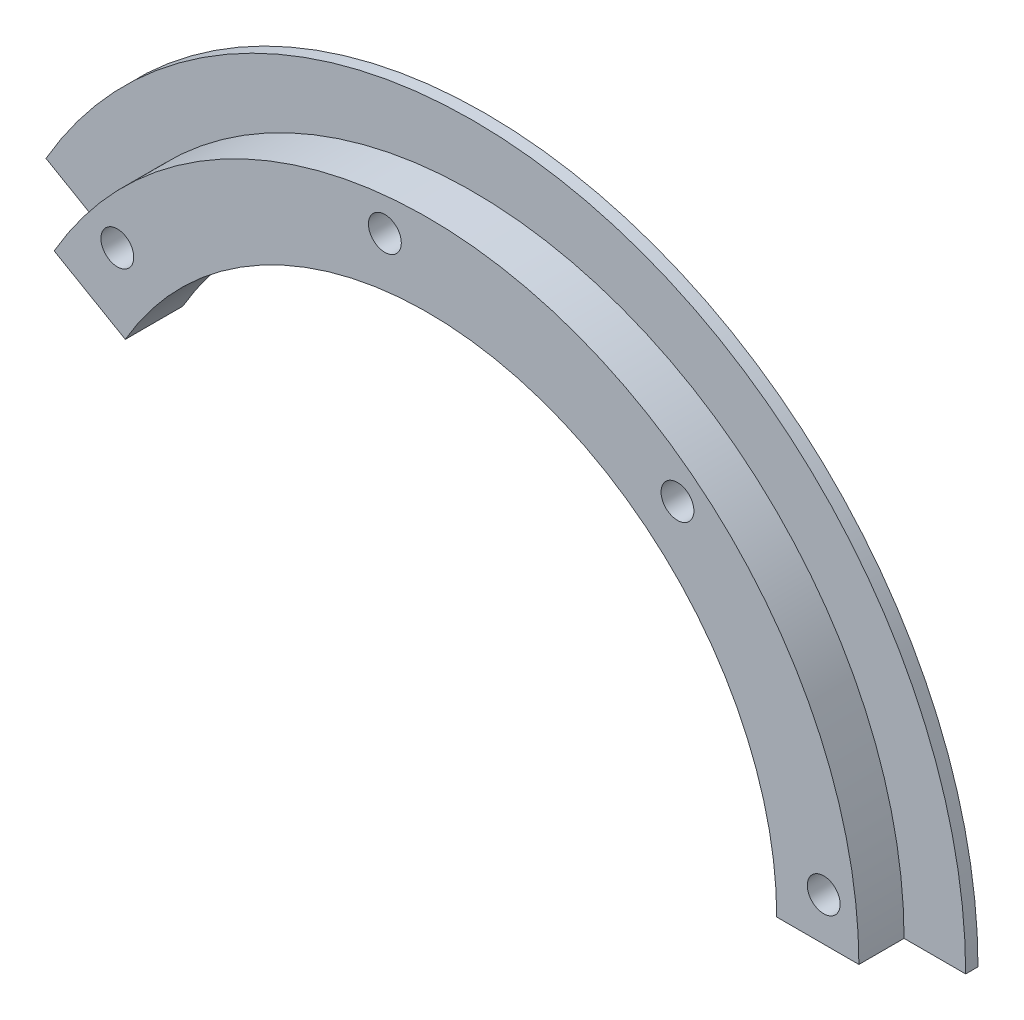
ISO-10303-21;
HEADER;
FILE_DESCRIPTION(('STEP AP214'),'2;1');
FILE_NAME('part.step','',(''),(''),'','','');
FILE_SCHEMA(('AUTOMOTIVE_DESIGN { 1 0 10303 214 1 1 1 1 }'));
ENDSEC;
DATA;
#1=APPLICATION_CONTEXT('core data for automotive mechanical design processes');
#2=APPLICATION_PROTOCOL_DEFINITION('international standard','automotive_design',2000,#1);
#3=PRODUCT_CONTEXT('',#1,'mechanical');
#4=PRODUCT('Part','Part','',(#3));
#5=PRODUCT_RELATED_PRODUCT_CATEGORY('part','',(#4));
#6=PRODUCT_DEFINITION_FORMATION('','',#4);
#7=PRODUCT_DEFINITION_CONTEXT('part definition',#1,'design');
#8=PRODUCT_DEFINITION('design','',#6,#7);
#9=PRODUCT_DEFINITION_SHAPE('','',#8);
#10=(LENGTH_UNIT() NAMED_UNIT(*) SI_UNIT(.MILLI.,.METRE.));
#11=(NAMED_UNIT(*) PLANE_ANGLE_UNIT() SI_UNIT($,.RADIAN.));
#12=(NAMED_UNIT(*) SI_UNIT($,.STERADIAN.) SOLID_ANGLE_UNIT());
#13=UNCERTAINTY_MEASURE_WITH_UNIT(LENGTH_MEASURE(1.E-05),#10,'distance_accuracy_value','');
#14=(GEOMETRIC_REPRESENTATION_CONTEXT(3) GLOBAL_UNCERTAINTY_ASSIGNED_CONTEXT((#13)) GLOBAL_UNIT_ASSIGNED_CONTEXT((#10,
#11,#12)) REPRESENTATION_CONTEXT('',''));
#15=CARTESIAN_POINT('',(0.,0.,0.));
#16=DIRECTION('',(0.,0.,1.));
#17=DIRECTION('',(1.,0.,0.));
#18=AXIS2_PLACEMENT_3D('',#15,#16,#17);
#19=CARTESIAN_POINT('',(0.,0.,7.));
#20=DIRECTION('',(0.,0.,-1.));
#21=DIRECTION('',(-1.,0.,0.));
#22=AXIS2_PLACEMENT_3D('',#19,#20,#21);
#23=CYLINDRICAL_SURFACE('',#22,60.);
#24=CARTESIAN_POINT('',(0.,0.,1.5));
#25=DIRECTION('',(0.,0.,1.));
#26=DIRECTION('',(1.,0.,0.));
#27=AXIS2_PLACEMENT_3D('',#24,#25,#26);
#28=CIRCLE('',#27,60.);
#29=CARTESIAN_POINT('',(60.,0.,1.5));
#30=VERTEX_POINT('',#29);
#31=CARTESIAN_POINT('',(-51.9615242270665,29.9999999999997,1.5));
#32=VERTEX_POINT('',#31);
#33=EDGE_CURVE('E117',#30,#32,#28,.T.);
#34=ORIENTED_EDGE('',*,*,#33,.F.);
#35=DIRECTION('',(0.,0.,-1.));
#36=VECTOR('',#35,1.);
#37=CARTESIAN_POINT('',(60.,0.,7.));
#38=LINE('',#37,#36);
#39=CARTESIAN_POINT('',(60.,0.,0.));
#40=VERTEX_POINT('',#39);
#41=EDGE_CURVE('E12',#30,#40,#38,.T.);
#42=ORIENTED_EDGE('',*,*,#41,.T.);
#43=CARTESIAN_POINT('',(0.,0.,0.));
#44=DIRECTION('',(0.,0.,1.));
#45=DIRECTION('',(1.,0.,0.));
#46=AXIS2_PLACEMENT_3D('',#43,#44,#45);
#47=CIRCLE('',#46,60.);
#48=CARTESIAN_POINT('',(-51.9615242270665,29.9999999999997,0.));
#49=VERTEX_POINT('',#48);
#50=EDGE_CURVE('E162',#40,#49,#47,.T.);
#51=ORIENTED_EDGE('',*,*,#50,.T.);
#52=DIRECTION('',(0.,0.,-1.));
#53=VECTOR('',#52,1.);
#54=CARTESIAN_POINT('',(-51.9615242270665,29.9999999999997,7.));
#55=LINE('',#54,#53);
#56=EDGE_CURVE('E110',#32,#49,#55,.T.);
#57=ORIENTED_EDGE('',*,*,#56,.F.);
#58=EDGE_LOOP('',(#34,#42,#51,#57));
#59=FACE_BOUND('',#58,.T.);
#60=ADVANCED_FACE('F102',(#59),#23,.T.);
#61=CARTESIAN_POINT('',(0.,0.,7.));
#62=DIRECTION('',(0.,0.,1.));
#63=DIRECTION('',(1.,0.,0.));
#64=AXIS2_PLACEMENT_3D('',#61,#62,#63);
#65=PLANE('',#64);
#66=CARTESIAN_POINT('',(0.,0.,7.));
#67=DIRECTION('',(0.,0.,-1.));
#68=DIRECTION('',(1.,0.,0.));
#69=AXIS2_PLACEMENT_3D('',#66,#67,#68);
#70=CIRCLE('',#69,52.5);
#71=CARTESIAN_POINT('',(-45.4663336986832,26.2499999999997,7.));
#72=VERTEX_POINT('',#71);
#73=CARTESIAN_POINT('',(52.5,0.,7.));
#74=VERTEX_POINT('',#73);
#75=EDGE_CURVE('E212',#72,#74,#70,.T.);
#76=ORIENTED_EDGE('',*,*,#75,.F.);
#77=DIRECTION('',(-0.866025403784441,0.499999999999995,0.));
#78=VECTOR('',#77,1.);
#79=CARTESIAN_POINT('',(-36.8060796608388,21.2499999999998,7.));
#80=LINE('',#79,#78);
#81=CARTESIAN_POINT('',(-36.8060796608388,21.2499999999998,7.));
#82=VERTEX_POINT('',#81);
#83=EDGE_CURVE('E169',#82,#72,#80,.T.);
#84=ORIENTED_EDGE('',*,*,#83,.F.);
#85=CARTESIAN_POINT('',(0.,0.,7.));
#86=DIRECTION('',(0.,0.,1.));
#87=DIRECTION('',(1.,0.,0.));
#88=AXIS2_PLACEMENT_3D('',#85,#86,#87);
#89=CIRCLE('',#88,42.5);
#90=CARTESIAN_POINT('',(42.5,0.,7.));
#91=VERTEX_POINT('',#90);
#92=EDGE_CURVE('E152',#91,#82,#89,.T.);
#93=ORIENTED_EDGE('',*,*,#92,.F.);
#94=DIRECTION('',(1.,0.,0.));
#95=VECTOR('',#94,1.);
#96=CARTESIAN_POINT('',(42.5,0.,7.));
#97=LINE('',#96,#95);
#98=EDGE_CURVE('E149',#91,#74,#97,.T.);
#99=ORIENTED_EDGE('',*,*,#98,.T.);
#100=EDGE_LOOP('',(#76,#84,#93,#99));
#101=FACE_BOUND('',#100,.T.);
#102=CARTESIAN_POINT('',(30.4145812703347,37.77834361311,7.));
#103=DIRECTION('',(0.,0.,1.));
#104=DIRECTION('',(1.,0.,0.));
#105=AXIS2_PLACEMENT_3D('',#102,#103,#104);
#106=CIRCLE('',#105,2.);
#107=CARTESIAN_POINT('',(32.4145812703347,37.77834361311,7.));
#108=VERTEX_POINT('',#107);
#109=EDGE_CURVE('E193',#108,#108,#106,.T.);
#110=ORIENTED_EDGE('',*,*,#109,.F.);
#111=EDGE_LOOP('',(#110));
#112=FACE_BOUND('',#111,.T.);
#113=CARTESIAN_POINT('',(-37.7783436131101,30.4145812703345,7.));
#114=DIRECTION('',(0.,0.,1.));
#115=DIRECTION('',(1.,0.,0.));
#116=AXIS2_PLACEMENT_3D('',#113,#114,#115);
#117=CIRCLE('',#116,2.00000000000001);
#118=CARTESIAN_POINT('',(-35.7783436131101,30.4145812703345,7.));
#119=VERTEX_POINT('',#118);
#120=EDGE_CURVE('E163',#119,#119,#117,.T.);
#121=ORIENTED_EDGE('',*,*,#120,.F.);
#122=EDGE_LOOP('',(#121));
#123=FACE_BOUND('',#122,.T.);
#124=CARTESIAN_POINT('',(-5.20696628762268,48.2196796140286,7.));
#125=DIRECTION('',(0.,0.,1.));
#126=DIRECTION('',(1.,0.,0.));
#127=AXIS2_PLACEMENT_3D('',#124,#125,#126);
#128=CIRCLE('',#127,2.);
#129=CARTESIAN_POINT('',(-3.20696628762267,48.2196796140286,7.));
#130=VERTEX_POINT('',#129);
#131=EDGE_CURVE('E187',#130,#130,#128,.T.);
#132=ORIENTED_EDGE('',*,*,#131,.F.);
#133=EDGE_LOOP('',(#132));
#134=FACE_BOUND('',#133,.T.);
#135=CARTESIAN_POINT('',(48.2196796140285,5.20696628762318,7.));
#136=DIRECTION('',(0.,0.,1.));
#137=DIRECTION('',(1.,0.,0.));
#138=AXIS2_PLACEMENT_3D('',#135,#136,#137);
#139=CIRCLE('',#138,2.);
#140=CARTESIAN_POINT('',(50.2196796140285,5.20696628762318,7.));
#141=VERTEX_POINT('',#140);
#142=EDGE_CURVE('E199',#141,#141,#139,.T.);
#143=ORIENTED_EDGE('',*,*,#142,.F.);
#144=EDGE_LOOP('',(#143));
#145=FACE_BOUND('',#144,.T.);
#146=ADVANCED_FACE('F237',(#101,#112,#123,#134,#145),#65,.T.);
#147=CARTESIAN_POINT('',(0.,0.,0.));
#148=DIRECTION('',(0.,0.,1.));
#149=DIRECTION('',(1.,0.,0.));
#150=AXIS2_PLACEMENT_3D('',#147,#148,#149);
#151=PLANE('',#150);
#152=DIRECTION('',(1.,0.,0.));
#153=VECTOR('',#152,1.);
#154=CARTESIAN_POINT('',(42.5,0.,0.));
#155=LINE('',#154,#153);
#156=CARTESIAN_POINT('',(42.5,0.,0.));
#157=VERTEX_POINT('',#156);
#158=EDGE_CURVE('E146',#157,#40,#155,.T.);
#159=ORIENTED_EDGE('',*,*,#158,.F.);
#160=CARTESIAN_POINT('',(0.,0.,0.));
#161=DIRECTION('',(0.,0.,1.));
#162=DIRECTION('',(1.,0.,0.));
#163=AXIS2_PLACEMENT_3D('',#160,#161,#162);
#164=CIRCLE('',#163,42.5);
#165=CARTESIAN_POINT('',(-36.8060796608388,21.2499999999998,0.));
#166=VERTEX_POINT('',#165);
#167=EDGE_CURVE('E160',#157,#166,#164,.T.);
#168=ORIENTED_EDGE('',*,*,#167,.T.);
#169=DIRECTION('',(-0.866025403784441,0.499999999999995,0.));
#170=VECTOR('',#169,1.);
#171=CARTESIAN_POINT('',(-36.8060796608388,21.2499999999998,0.));
#172=LINE('',#171,#170);
#173=EDGE_CURVE('E167',#166,#49,#172,.T.);
#174=ORIENTED_EDGE('',*,*,#173,.T.);
#175=ORIENTED_EDGE('',*,*,#50,.F.);
#176=EDGE_LOOP('',(#159,#168,#174,#175));
#177=FACE_BOUND('',#176,.T.);
#178=CARTESIAN_POINT('',(-37.7783436131101,30.4145812703345,0.));
#179=DIRECTION('',(0.,0.,1.));
#180=DIRECTION('',(1.,0.,0.));
#181=AXIS2_PLACEMENT_3D('',#178,#179,#180);
#182=CIRCLE('',#181,2.00000000000001);
#183=CARTESIAN_POINT('',(-35.7783436131101,30.4145812703345,0.));
#184=VERTEX_POINT('',#183);
#185=EDGE_CURVE('E184',#184,#184,#182,.T.);
#186=ORIENTED_EDGE('',*,*,#185,.T.);
#187=EDGE_LOOP('',(#186));
#188=FACE_BOUND('',#187,.T.);
#189=CARTESIAN_POINT('',(-5.20696628762268,48.2196796140286,0.));
#190=DIRECTION('',(0.,0.,1.));
#191=DIRECTION('',(1.,0.,0.));
#192=AXIS2_PLACEMENT_3D('',#189,#190,#191);
#193=CIRCLE('',#192,2.);
#194=CARTESIAN_POINT('',(-3.20696628762267,48.2196796140286,0.));
#195=VERTEX_POINT('',#194);
#196=EDGE_CURVE('E190',#195,#195,#193,.T.);
#197=ORIENTED_EDGE('',*,*,#196,.T.);
#198=EDGE_LOOP('',(#197));
#199=FACE_BOUND('',#198,.T.);
#200=CARTESIAN_POINT('',(30.4145812703347,37.77834361311,0.));
#201=DIRECTION('',(0.,0.,1.));
#202=DIRECTION('',(1.,0.,0.));
#203=AXIS2_PLACEMENT_3D('',#200,#201,#202);
#204=CIRCLE('',#203,2.);
#205=CARTESIAN_POINT('',(32.4145812703347,37.77834361311,0.));
#206=VERTEX_POINT('',#205);
#207=EDGE_CURVE('E196',#206,#206,#204,.T.);
#208=ORIENTED_EDGE('',*,*,#207,.T.);
#209=EDGE_LOOP('',(#208));
#210=FACE_BOUND('',#209,.T.);
#211=CARTESIAN_POINT('',(48.2196796140285,5.20696628762318,0.));
#212=DIRECTION('',(0.,0.,1.));
#213=DIRECTION('',(1.,0.,0.));
#214=AXIS2_PLACEMENT_3D('',#211,#212,#213);
#215=CIRCLE('',#214,2.);
#216=CARTESIAN_POINT('',(50.2196796140285,5.20696628762318,0.));
#217=VERTEX_POINT('',#216);
#218=EDGE_CURVE('E202',#217,#217,#215,.T.);
#219=ORIENTED_EDGE('',*,*,#218,.T.);
#220=EDGE_LOOP('',(#219));
#221=FACE_BOUND('',#220,.T.);
#222=ADVANCED_FACE('F157',(#177,#188,#199,#210,#221),#151,.F.);
#223=CARTESIAN_POINT('',(42.5,0.,7.));
#224=DIRECTION('',(0.,1.,0.));
#225=DIRECTION('',(0.,0.,1.));
#226=AXIS2_PLACEMENT_3D('',#223,#224,#225);
#227=PLANE('',#226);
#228=DIRECTION('',(1.,0.,0.));
#229=VECTOR('',#228,1.);
#230=CARTESIAN_POINT('',(52.5,0.,1.5));
#231=LINE('',#230,#229);
#232=CARTESIAN_POINT('',(52.5,0.,1.5));
#233=VERTEX_POINT('',#232);
#234=EDGE_CURVE('E218',#233,#30,#231,.T.);
#235=ORIENTED_EDGE('',*,*,#234,.F.);
#236=DIRECTION('',(0.,0.,1.));
#237=VECTOR('',#236,1.);
#238=CARTESIAN_POINT('',(52.5,0.,1.5));
#239=LINE('',#238,#237);
#240=EDGE_CURVE('E208',#233,#74,#239,.T.);
#241=ORIENTED_EDGE('',*,*,#240,.T.);
#242=ORIENTED_EDGE('',*,*,#98,.F.);
#243=DIRECTION('',(0.,0.,-1.));
#244=VECTOR('',#243,1.);
#245=CARTESIAN_POINT('',(42.5,0.,7.));
#246=LINE('',#245,#244);
#247=EDGE_CURVE('E126',#91,#157,#246,.T.);
#248=ORIENTED_EDGE('',*,*,#247,.T.);
#249=ORIENTED_EDGE('',*,*,#158,.T.);
#250=ORIENTED_EDGE('',*,*,#41,.F.);
#251=EDGE_LOOP('',(#235,#241,#242,#248,#249,#250));
#252=FACE_BOUND('',#251,.T.);
#253=ADVANCED_FACE('F104',(#252),#227,.F.);
#254=CARTESIAN_POINT('',(-36.8060796608388,21.2499999999998,7.));
#255=DIRECTION('',(-0.499999999999995,-0.866025403784441,0.));
#256=DIRECTION('',(0.866025403784442,-0.499999999999995,0.));
#257=AXIS2_PLACEMENT_3D('',#254,#255,#256);
#258=PLANE('',#257);
#259=DIRECTION('',(0.,0.,1.));
#260=VECTOR('',#259,1.);
#261=CARTESIAN_POINT('',(-45.4663336986832,26.2499999999997,1.5));
#262=LINE('',#261,#260);
#263=CARTESIAN_POINT('',(-45.4663336986832,26.2499999999997,1.5));
#264=VERTEX_POINT('',#263);
#265=EDGE_CURVE('E205',#264,#72,#262,.T.);
#266=ORIENTED_EDGE('',*,*,#265,.F.);
#267=DIRECTION('',(0.866025403784442,-0.499999999999994,0.));
#268=VECTOR('',#267,1.);
#269=CARTESIAN_POINT('',(-51.9615242270665,29.9999999999997,1.5));
#270=LINE('',#269,#268);
#271=EDGE_CURVE('E178',#32,#264,#270,.T.);
#272=ORIENTED_EDGE('',*,*,#271,.F.);
#273=ORIENTED_EDGE('',*,*,#56,.T.);
#274=ORIENTED_EDGE('',*,*,#173,.F.);
#275=DIRECTION('',(0.,0.,-1.));
#276=VECTOR('',#275,1.);
#277=CARTESIAN_POINT('',(-36.8060796608388,21.2499999999998,7.));
#278=LINE('',#277,#276);
#279=EDGE_CURVE('E151',#82,#166,#278,.T.);
#280=ORIENTED_EDGE('',*,*,#279,.F.);
#281=ORIENTED_EDGE('',*,*,#83,.T.);
#282=EDGE_LOOP('',(#266,#272,#273,#274,#280,#281));
#283=FACE_BOUND('',#282,.T.);
#284=ADVANCED_FACE('F177',(#283),#258,.T.);
#285=CARTESIAN_POINT('',(0.,0.,7.));
#286=DIRECTION('',(0.,0.,-1.));
#287=DIRECTION('',(-1.,0.,0.));
#288=AXIS2_PLACEMENT_3D('',#285,#286,#287);
#289=CYLINDRICAL_SURFACE('',#288,42.5);
#290=ORIENTED_EDGE('',*,*,#167,.F.);
#291=ORIENTED_EDGE('',*,*,#247,.F.);
#292=ORIENTED_EDGE('',*,*,#92,.T.);
#293=ORIENTED_EDGE('',*,*,#279,.T.);
#294=EDGE_LOOP('',(#290,#291,#292,#293));
#295=FACE_BOUND('',#294,.T.);
#296=ADVANCED_FACE('F165',(#295),#289,.F.);
#297=CARTESIAN_POINT('',(-37.7783436131101,30.4145812703345,7.));
#298=DIRECTION('',(0.,0.,-1.));
#299=DIRECTION('',(-1.,0.,0.));
#300=AXIS2_PLACEMENT_3D('',#297,#298,#299);
#301=CYLINDRICAL_SURFACE('',#300,2.00000000000001);
#302=ORIENTED_EDGE('',*,*,#120,.T.);
#303=EDGE_LOOP('',(#302));
#304=FACE_BOUND('',#303,.T.);
#305=ORIENTED_EDGE('',*,*,#185,.F.);
#306=EDGE_LOOP('',(#305));
#307=FACE_BOUND('',#306,.T.);
#308=ADVANCED_FACE('F268',(#304,#307),#301,.F.);
#309=CARTESIAN_POINT('',(-5.20696628762268,48.2196796140286,7.));
#310=DIRECTION('',(0.,0.,-1.));
#311=DIRECTION('',(-1.,0.,0.));
#312=AXIS2_PLACEMENT_3D('',#309,#310,#311);
#313=CYLINDRICAL_SURFACE('',#312,2.);
#314=ORIENTED_EDGE('',*,*,#131,.T.);
#315=EDGE_LOOP('',(#314));
#316=FACE_BOUND('',#315,.T.);
#317=ORIENTED_EDGE('',*,*,#196,.F.);
#318=EDGE_LOOP('',(#317));
#319=FACE_BOUND('',#318,.T.);
#320=ADVANCED_FACE('F272',(#316,#319),#313,.F.);
#321=CARTESIAN_POINT('',(30.4145812703347,37.77834361311,7.));
#322=DIRECTION('',(0.,0.,-1.));
#323=DIRECTION('',(-1.,0.,0.));
#324=AXIS2_PLACEMENT_3D('',#321,#322,#323);
#325=CYLINDRICAL_SURFACE('',#324,2.);
#326=ORIENTED_EDGE('',*,*,#109,.T.);
#327=EDGE_LOOP('',(#326));
#328=FACE_BOUND('',#327,.T.);
#329=ORIENTED_EDGE('',*,*,#207,.F.);
#330=EDGE_LOOP('',(#329));
#331=FACE_BOUND('',#330,.T.);
#332=ADVANCED_FACE('F252',(#328,#331),#325,.F.);
#333=CARTESIAN_POINT('',(48.2196796140285,5.20696628762318,7.));
#334=DIRECTION('',(0.,0.,-1.));
#335=DIRECTION('',(-1.,0.,0.));
#336=AXIS2_PLACEMENT_3D('',#333,#334,#335);
#337=CYLINDRICAL_SURFACE('',#336,2.);
#338=ORIENTED_EDGE('',*,*,#142,.T.);
#339=EDGE_LOOP('',(#338));
#340=FACE_BOUND('',#339,.T.);
#341=ORIENTED_EDGE('',*,*,#218,.F.);
#342=EDGE_LOOP('',(#341));
#343=FACE_BOUND('',#342,.T.);
#344=ADVANCED_FACE('F249',(#340,#343),#337,.F.);
#345=CARTESIAN_POINT('',(0.,0.,1.5));
#346=DIRECTION('',(0.,0.,1.));
#347=DIRECTION('',(1.,0.,0.));
#348=AXIS2_PLACEMENT_3D('',#345,#346,#347);
#349=CYLINDRICAL_SURFACE('',#348,52.5);
#350=ORIENTED_EDGE('',*,*,#75,.T.);
#351=ORIENTED_EDGE('',*,*,#240,.F.);
#352=CARTESIAN_POINT('',(0.,0.,1.5));
#353=DIRECTION('',(0.,0.,-1.));
#354=DIRECTION('',(1.,0.,0.));
#355=AXIS2_PLACEMENT_3D('',#352,#353,#354);
#356=CIRCLE('',#355,52.5);
#357=EDGE_CURVE('E215',#264,#233,#356,.T.);
#358=ORIENTED_EDGE('',*,*,#357,.F.);
#359=ORIENTED_EDGE('',*,*,#265,.T.);
#360=EDGE_LOOP('',(#350,#351,#358,#359));
#361=FACE_BOUND('',#360,.T.);
#362=ADVANCED_FACE('F234',(#361),#349,.T.);
#363=CARTESIAN_POINT('',(0.,0.,1.5));
#364=DIRECTION('',(0.,0.,1.));
#365=DIRECTION('',(1.,0.,0.));
#366=AXIS2_PLACEMENT_3D('',#363,#364,#365);
#367=PLANE('',#366);
#368=ORIENTED_EDGE('',*,*,#357,.T.);
#369=ORIENTED_EDGE('',*,*,#234,.T.);
#370=ORIENTED_EDGE('',*,*,#33,.T.);
#371=ORIENTED_EDGE('',*,*,#271,.T.);
#372=EDGE_LOOP('',(#368,#369,#370,#371));
#373=FACE_BOUND('',#372,.T.);
#374=ADVANCED_FACE('F223',(#373),#367,.T.);
#375=CLOSED_SHELL('',(#60,#146,#222,#253,#284,#296,#308,#320,#332,#344,#362,#374));
#376=MANIFOLD_SOLID_BREP('B2',#375);
#377=ADVANCED_BREP_SHAPE_REPRESENTATION('',(#18,#376),#14);
#378=SHAPE_DEFINITION_REPRESENTATION(#9,#377);
ENDSEC;
END-ISO-10303-21;
